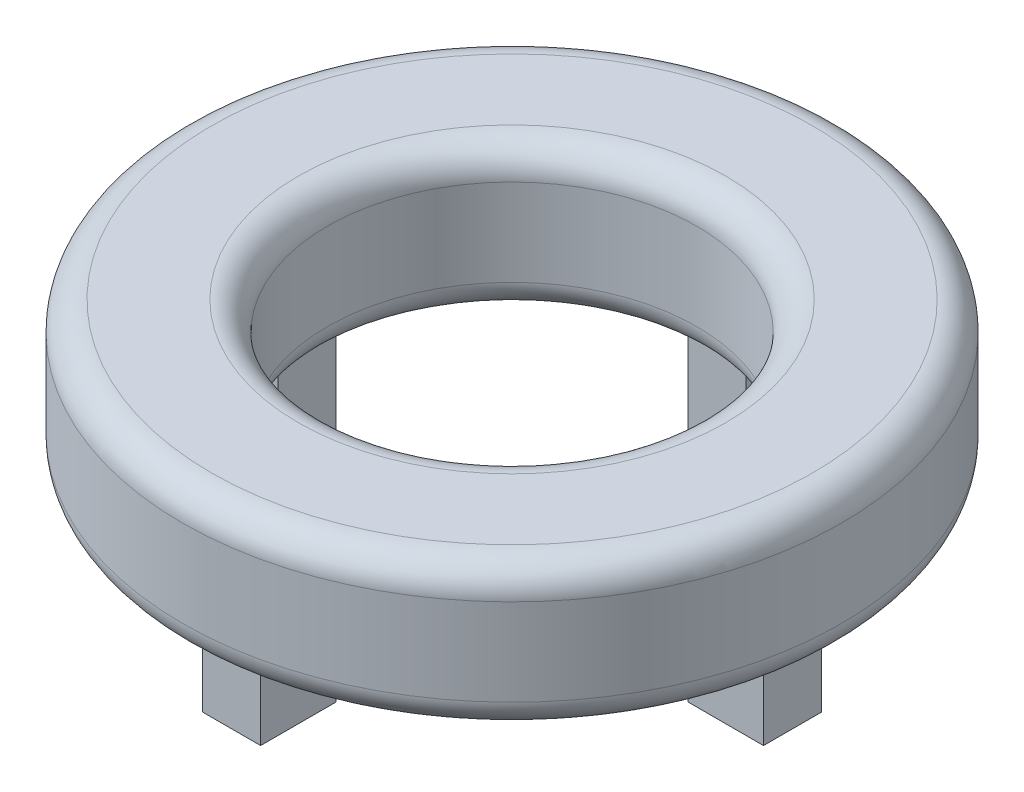
ISO-10303-21;
HEADER;
FILE_DESCRIPTION(('STEP AP214'),'2;1');
FILE_NAME('part.step','',(''),(''),'','','');
FILE_SCHEMA(('AUTOMOTIVE_DESIGN { 1 0 10303 214 1 1 1 1 }'));
ENDSEC;
DATA;
#1=APPLICATION_CONTEXT('core data for automotive mechanical design processes');
#2=APPLICATION_PROTOCOL_DEFINITION('international standard','automotive_design',2000,#1);
#3=PRODUCT_CONTEXT('',#1,'mechanical');
#4=PRODUCT('Part','Part','',(#3));
#5=PRODUCT_RELATED_PRODUCT_CATEGORY('part','',(#4));
#6=PRODUCT_DEFINITION_FORMATION('','',#4);
#7=PRODUCT_DEFINITION_CONTEXT('part definition',#1,'design');
#8=PRODUCT_DEFINITION('design','',#6,#7);
#9=PRODUCT_DEFINITION_SHAPE('','',#8);
#10=(LENGTH_UNIT() NAMED_UNIT(*) SI_UNIT(.MILLI.,.METRE.));
#11=(NAMED_UNIT(*) PLANE_ANGLE_UNIT() SI_UNIT($,.RADIAN.));
#12=(NAMED_UNIT(*) SI_UNIT($,.STERADIAN.) SOLID_ANGLE_UNIT());
#13=UNCERTAINTY_MEASURE_WITH_UNIT(LENGTH_MEASURE(1.E-05),#10,'distance_accuracy_value','');
#14=(GEOMETRIC_REPRESENTATION_CONTEXT(3) GLOBAL_UNCERTAINTY_ASSIGNED_CONTEXT((#13)) GLOBAL_UNIT_ASSIGNED_CONTEXT((#10,
#11,#12)) REPRESENTATION_CONTEXT('',''));
#15=CARTESIAN_POINT('',(0.,0.,0.));
#16=DIRECTION('',(0.,0.,1.));
#17=DIRECTION('',(1.,0.,0.));
#18=AXIS2_PLACEMENT_3D('',#15,#16,#17);
#19=CARTESIAN_POINT('',(0.,0.,0.));
#20=DIRECTION('',(0.,1.,0.));
#21=DIRECTION('',(0.,0.,1.));
#22=AXIS2_PLACEMENT_3D('',#19,#20,#21);
#23=PLANE('',#22);
#24=CARTESIAN_POINT('',(0.,0.,0.));
#25=DIRECTION('',(0.,1.,0.));
#26=DIRECTION('',(0.,0.,1.));
#27=AXIS2_PLACEMENT_3D('',#24,#25,#26);
#28=CIRCLE('',#27,51.8858506133116);
#29=CARTESIAN_POINT('',(0.,0.,51.8858506133116));
#30=VERTEX_POINT('',#29);
#31=EDGE_CURVE('E334',#30,#30,#28,.F.);
#32=ORIENTED_EDGE('',*,*,#31,.T.);
#33=EDGE_LOOP('',(#32));
#34=FACE_BOUND('',#33,.T.);
#35=DIRECTION('',(0.,0.,1.));
#36=VECTOR('',#35,1.);
#37=CARTESIAN_POINT('',(4.99999999999949,0.,48.4000000000001));
#38=LINE('',#37,#36);
#39=CARTESIAN_POINT('',(4.99999999999962,0.,36.5453960912663));
#40=VERTEX_POINT('',#39);
#41=CARTESIAN_POINT('',(4.99999999999949,0.,48.4000000000001));
#42=VERTEX_POINT('',#41);
#43=EDGE_CURVE('E537',#40,#42,#38,.T.);
#44=ORIENTED_EDGE('',*,*,#43,.F.);
#45=CARTESIAN_POINT('',(0.,0.,0.));
#46=DIRECTION('',(0.,1.,0.));
#47=DIRECTION('',(0.,0.,1.));
#48=AXIS2_PLACEMENT_3D('',#45,#46,#47);
#49=CIRCLE('',#48,36.8858506133116);
#50=CARTESIAN_POINT('',(36.5453960912662,0.,5.));
#51=VERTEX_POINT('',#50);
#52=EDGE_CURVE('E343',#40,#51,#49,.T.);
#53=ORIENTED_EDGE('',*,*,#52,.T.);
#54=DIRECTION('',(-1.,0.,0.));
#55=VECTOR('',#54,1.);
#56=CARTESIAN_POINT('',(48.4,0.,5.));
#57=LINE('',#56,#55);
#58=CARTESIAN_POINT('',(48.4,0.,5.));
#59=VERTEX_POINT('',#58);
#60=EDGE_CURVE('E222',#59,#51,#57,.T.);
#61=ORIENTED_EDGE('',*,*,#60,.F.);
#62=DIRECTION('',(0.,0.,1.));
#63=VECTOR('',#62,1.);
#64=CARTESIAN_POINT('',(48.4,0.,-5.));
#65=LINE('',#64,#63);
#66=CARTESIAN_POINT('',(48.4,0.,-5.));
#67=VERTEX_POINT('',#66);
#68=EDGE_CURVE('E235',#67,#59,#65,.T.);
#69=ORIENTED_EDGE('',*,*,#68,.F.);
#70=DIRECTION('',(1.,0.,0.));
#71=VECTOR('',#70,1.);
#72=CARTESIAN_POINT('',(48.4,0.,-5.));
#73=LINE('',#72,#71);
#74=CARTESIAN_POINT('',(36.5453960912662,0.,-5.));
#75=VERTEX_POINT('',#74);
#76=EDGE_CURVE('E231',#75,#67,#73,.T.);
#77=ORIENTED_EDGE('',*,*,#76,.F.);
#78=CARTESIAN_POINT('',(5.00000000000013,0.,-36.5453960912662));
#79=VERTEX_POINT('',#78);
#80=EDGE_CURVE('E840',#75,#79,#49,.T.);
#81=ORIENTED_EDGE('',*,*,#80,.T.);
#82=DIRECTION('',(0.,0.,1.));
#83=VECTOR('',#82,1.);
#84=CARTESIAN_POINT('',(5.00000000000017,0.,-48.4));
#85=LINE('',#84,#83);
#86=CARTESIAN_POINT('',(5.00000000000017,0.,-48.4));
#87=VERTEX_POINT('',#86);
#88=EDGE_CURVE('E263',#87,#79,#85,.T.);
#89=ORIENTED_EDGE('',*,*,#88,.F.);
#90=DIRECTION('',(1.,0.,0.));
#91=VECTOR('',#90,1.);
#92=CARTESIAN_POINT('',(-4.99999999999983,0.,-48.4));
#93=LINE('',#92,#91);
#94=CARTESIAN_POINT('',(-4.99999999999983,0.,-48.4));
#95=VERTEX_POINT('',#94);
#96=EDGE_CURVE('E276',#95,#87,#93,.T.);
#97=ORIENTED_EDGE('',*,*,#96,.F.);
#98=DIRECTION('',(0.,0.,-1.));
#99=VECTOR('',#98,1.);
#100=CARTESIAN_POINT('',(-4.99999999999983,0.,-48.4));
#101=LINE('',#100,#99);
#102=CARTESIAN_POINT('',(-4.99999999999987,0.,-36.5453960912906));
#103=VERTEX_POINT('',#102);
#104=EDGE_CURVE('E272',#103,#95,#101,.T.);
#105=ORIENTED_EDGE('',*,*,#104,.F.);
#106=CARTESIAN_POINT('',(-36.5453960912662,0.,-5.));
#107=VERTEX_POINT('',#106);
#108=EDGE_CURVE('E337',#103,#107,#49,.T.);
#109=ORIENTED_EDGE('',*,*,#108,.T.);
#110=DIRECTION('',(1.,0.,0.));
#111=VECTOR('',#110,1.);
#112=CARTESIAN_POINT('',(-48.4,0.,-5.));
#113=LINE('',#112,#111);
#114=CARTESIAN_POINT('',(-48.4,0.,-5.));
#115=VERTEX_POINT('',#114);
#116=EDGE_CURVE('E304',#115,#107,#113,.T.);
#117=ORIENTED_EDGE('',*,*,#116,.F.);
#118=DIRECTION('',(0.,0.,-1.));
#119=VECTOR('',#118,1.);
#120=CARTESIAN_POINT('',(-48.4,0.,5.));
#121=LINE('',#120,#119);
#122=CARTESIAN_POINT('',(-48.4,0.,5.));
#123=VERTEX_POINT('',#122);
#124=EDGE_CURVE('E317',#123,#115,#121,.T.);
#125=ORIENTED_EDGE('',*,*,#124,.F.);
#126=DIRECTION('',(-1.,0.,0.));
#127=VECTOR('',#126,1.);
#128=CARTESIAN_POINT('',(-48.4,0.,5.));
#129=LINE('',#128,#127);
#130=CARTESIAN_POINT('',(-36.5453960912908,0.,5.));
#131=VERTEX_POINT('',#130);
#132=EDGE_CURVE('E313',#131,#123,#129,.T.);
#133=ORIENTED_EDGE('',*,*,#132,.F.);
#134=CARTESIAN_POINT('',(-5.00000000000038,0.,36.5453960912662));
#135=VERTEX_POINT('',#134);
#136=EDGE_CURVE('E342',#131,#135,#49,.T.);
#137=ORIENTED_EDGE('',*,*,#136,.T.);
#138=DIRECTION('',(0.,0.,-1.));
#139=VECTOR('',#138,1.);
#140=CARTESIAN_POINT('',(-5.00000000000051,0.,48.3999999999999));
#141=LINE('',#140,#139);
#142=CARTESIAN_POINT('',(-5.00000000000051,0.,48.3999999999999));
#143=VERTEX_POINT('',#142);
#144=EDGE_CURVE('E63',#143,#135,#141,.T.);
#145=ORIENTED_EDGE('',*,*,#144,.F.);
#146=DIRECTION('',(-1.,0.,0.));
#147=VECTOR('',#146,1.);
#148=CARTESIAN_POINT('',(4.99999999999949,0.,48.4000000000001));
#149=LINE('',#148,#147);
#150=EDGE_CURVE('E58',#42,#143,#149,.T.);
#151=ORIENTED_EDGE('',*,*,#150,.F.);
#152=EDGE_LOOP('',(#44,#53,#61,#69,#77,#81,#89,#97,#105,#109,#117,#125,#133,#137,#145,#151));
#153=FACE_BOUND('',#152,.T.);
#154=ADVANCED_FACE('F43',(#34,#153),#23,.F.);
#155=CARTESIAN_POINT('',(0.,25.,0.));
#156=DIRECTION('',(0.,1.,0.));
#157=DIRECTION('',(0.,0.,1.));
#158=AXIS2_PLACEMENT_3D('',#155,#156,#157);
#159=PLANE('',#158);
#160=CARTESIAN_POINT('',(0.,25.,0.));
#161=DIRECTION('',(0.,1.,0.));
#162=DIRECTION('',(0.,0.,1.));
#163=AXIS2_PLACEMENT_3D('',#160,#161,#162);
#164=CIRCLE('',#163,36.8858506133116);
#165=CARTESIAN_POINT('',(0.,25.,36.8858506133116));
#166=VERTEX_POINT('',#165);
#167=EDGE_CURVE('E12',#166,#166,#164,.F.);
#168=ORIENTED_EDGE('',*,*,#167,.T.);
#169=EDGE_LOOP('',(#168));
#170=FACE_BOUND('',#169,.T.);
#171=CARTESIAN_POINT('',(0.,25.,0.));
#172=DIRECTION('',(0.,1.,0.));
#173=DIRECTION('',(0.,0.,1.));
#174=AXIS2_PLACEMENT_3D('',#171,#172,#173);
#175=CIRCLE('',#174,51.8858506133116);
#176=CARTESIAN_POINT('',(0.,25.,51.8858506133116));
#177=VERTEX_POINT('',#176);
#178=EDGE_CURVE('E51',#177,#177,#175,.T.);
#179=ORIENTED_EDGE('',*,*,#178,.T.);
#180=EDGE_LOOP('',(#179));
#181=FACE_BOUND('',#180,.T.);
#182=ADVANCED_FACE('F357',(#170,#181),#159,.T.);
#183=CARTESIAN_POINT('',(0.,25.,0.));
#184=DIRECTION('',(0.,-1.,0.));
#185=DIRECTION('',(0.,0.,-1.));
#186=AXIS2_PLACEMENT_3D('',#183,#184,#185);
#187=CYLINDRICAL_SURFACE('',#186,56.8858506133116);
#188=CARTESIAN_POINT('',(0.,5.,0.));
#189=DIRECTION('',(0.,1.,0.));
#190=DIRECTION('',(0.,0.,1.));
#191=AXIS2_PLACEMENT_3D('',#188,#189,#190);
#192=CIRCLE('',#191,56.8858506133116);
#193=CARTESIAN_POINT('',(0.,5.,56.8858506133116));
#194=VERTEX_POINT('',#193);
#195=EDGE_CURVE('E352',#194,#194,#192,.T.);
#196=ORIENTED_EDGE('',*,*,#195,.T.);
#197=EDGE_LOOP('',(#196));
#198=FACE_BOUND('',#197,.T.);
#199=CARTESIAN_POINT('',(0.,20.,0.));
#200=DIRECTION('',(0.,1.,0.));
#201=DIRECTION('',(0.,0.,1.));
#202=AXIS2_PLACEMENT_3D('',#199,#200,#201);
#203=CIRCLE('',#202,56.8858506133116);
#204=CARTESIAN_POINT('',(0.,20.,56.8858506133116));
#205=VERTEX_POINT('',#204);
#206=EDGE_CURVE('E349',#205,#205,#203,.F.);
#207=ORIENTED_EDGE('',*,*,#206,.T.);
#208=EDGE_LOOP('',(#207));
#209=FACE_BOUND('',#208,.T.);
#210=ADVANCED_FACE('F381',(#198,#209),#187,.T.);
#211=CARTESIAN_POINT('',(0.,25.,0.));
#212=DIRECTION('',(0.,-1.,0.));
#213=DIRECTION('',(0.,0.,-1.));
#214=AXIS2_PLACEMENT_3D('',#211,#212,#213);
#215=CYLINDRICAL_SURFACE('',#214,31.8858506133116);
#216=CARTESIAN_POINT('',(0.,5.,0.));
#217=DIRECTION('',(0.,1.,0.));
#218=DIRECTION('',(0.,0.,1.));
#219=AXIS2_PLACEMENT_3D('',#216,#217,#218);
#220=CIRCLE('',#219,31.8858506133116);
#221=CARTESIAN_POINT('',(0.,5.,31.8858506133116));
#222=VERTEX_POINT('',#221);
#223=EDGE_CURVE('E346',#222,#222,#220,.F.);
#224=ORIENTED_EDGE('',*,*,#223,.T.);
#225=EDGE_LOOP('',(#224));
#226=FACE_BOUND('',#225,.T.);
#227=CARTESIAN_POINT('',(0.,20.,0.));
#228=DIRECTION('',(0.,1.,0.));
#229=DIRECTION('',(0.,0.,1.));
#230=AXIS2_PLACEMENT_3D('',#227,#228,#229);
#231=CIRCLE('',#230,31.8858506133116);
#232=CARTESIAN_POINT('',(0.,20.,31.8858506133116));
#233=VERTEX_POINT('',#232);
#234=EDGE_CURVE('E341',#233,#233,#231,.T.);
#235=ORIENTED_EDGE('',*,*,#234,.T.);
#236=EDGE_LOOP('',(#235));
#237=FACE_BOUND('',#236,.T.);
#238=ADVANCED_FACE('F491',(#226,#237),#215,.F.);
#239=CARTESIAN_POINT('',(0.,5.,0.));
#240=DIRECTION('',(0.,1.,0.));
#241=DIRECTION('',(0.,0.,1.));
#242=AXIS2_PLACEMENT_3D('',#239,#240,#241);
#243=TOROIDAL_SURFACE('',#242,36.8858506133116,5.);
#244=ORIENTED_EDGE('',*,*,#223,.F.);
#245=EDGE_LOOP('',(#244));
#246=FACE_BOUND('',#245,.T.);
#247=EDGE_CURVE('E338',#107,#131,#49,.T.);
#248=ORIENTED_EDGE('',*,*,#247,.F.);
#249=ORIENTED_EDGE('',*,*,#108,.F.);
#250=EDGE_CURVE('E521',#79,#103,#49,.T.);
#251=ORIENTED_EDGE('',*,*,#250,.F.);
#252=ORIENTED_EDGE('',*,*,#80,.F.);
#253=EDGE_CURVE('E837',#51,#75,#49,.T.);
#254=ORIENTED_EDGE('',*,*,#253,.F.);
#255=ORIENTED_EDGE('',*,*,#52,.F.);
#256=EDGE_CURVE('E520',#135,#40,#49,.T.);
#257=ORIENTED_EDGE('',*,*,#256,.F.);
#258=ORIENTED_EDGE('',*,*,#136,.F.);
#259=EDGE_LOOP('',(#248,#249,#251,#252,#254,#255,#257,#258));
#260=FACE_BOUND('',#259,.T.);
#261=ADVANCED_FACE('F493',(#246,#260),#243,.T.);
#262=CARTESIAN_POINT('',(0.,5.,0.));
#263=DIRECTION('',(0.,1.,0.));
#264=DIRECTION('',(0.,0.,1.));
#265=AXIS2_PLACEMENT_3D('',#262,#263,#264);
#266=TOROIDAL_SURFACE('',#265,51.8858506133116,5.);
#267=ORIENTED_EDGE('',*,*,#31,.F.);
#268=EDGE_LOOP('',(#267));
#269=FACE_BOUND('',#268,.T.);
#270=ORIENTED_EDGE('',*,*,#195,.F.);
#271=EDGE_LOOP('',(#270));
#272=FACE_BOUND('',#271,.T.);
#273=ADVANCED_FACE('F370',(#269,#272),#266,.T.);
#274=CARTESIAN_POINT('',(0.,20.,0.));
#275=DIRECTION('',(0.,1.,0.));
#276=DIRECTION('',(0.,0.,1.));
#277=AXIS2_PLACEMENT_3D('',#274,#275,#276);
#278=TOROIDAL_SURFACE('',#277,36.8858506133116,5.);
#279=ORIENTED_EDGE('',*,*,#167,.F.);
#280=EDGE_LOOP('',(#279));
#281=FACE_BOUND('',#280,.T.);
#282=ORIENTED_EDGE('',*,*,#234,.F.);
#283=EDGE_LOOP('',(#282));
#284=FACE_BOUND('',#283,.T.);
#285=ADVANCED_FACE('F361',(#281,#284),#278,.T.);
#286=CARTESIAN_POINT('',(0.,20.,0.));
#287=DIRECTION('',(0.,1.,0.));
#288=DIRECTION('',(0.,0.,1.));
#289=AXIS2_PLACEMENT_3D('',#286,#287,#288);
#290=TOROIDAL_SURFACE('',#289,51.8858506133116,5.);
#291=ORIENTED_EDGE('',*,*,#206,.F.);
#292=EDGE_LOOP('',(#291));
#293=FACE_BOUND('',#292,.T.);
#294=ORIENTED_EDGE('',*,*,#178,.F.);
#295=EDGE_LOOP('',(#294));
#296=FACE_BOUND('',#295,.T.);
#297=ADVANCED_FACE('F45',(#293,#296),#290,.T.);
#298=CARTESIAN_POINT('',(0.,-15.,0.));
#299=DIRECTION('',(0.,-1.,0.));
#300=DIRECTION('',(0.,0.,-1.));
#301=AXIS2_PLACEMENT_3D('',#298,#299,#300);
#302=PLANE('',#301);
#303=DIRECTION('',(0.,0.,1.));
#304=VECTOR('',#303,1.);
#305=CARTESIAN_POINT('',(-35.4,-15.,5.));
#306=LINE('',#305,#304);
#307=CARTESIAN_POINT('',(-35.4,-15.,-5.));
#308=VERTEX_POINT('',#307);
#309=CARTESIAN_POINT('',(-35.4,-15.,5.));
#310=VERTEX_POINT('',#309);
#311=EDGE_CURVE('E300',#308,#310,#306,.T.);
#312=ORIENTED_EDGE('',*,*,#311,.T.);
#313=DIRECTION('',(-1.,0.,0.));
#314=VECTOR('',#313,1.);
#315=CARTESIAN_POINT('',(-48.4,-15.,5.));
#316=LINE('',#315,#314);
#317=CARTESIAN_POINT('',(-48.4,-15.,5.));
#318=VERTEX_POINT('',#317);
#319=EDGE_CURVE('E303',#310,#318,#316,.T.);
#320=ORIENTED_EDGE('',*,*,#319,.T.);
#321=DIRECTION('',(0.,0.,-1.));
#322=VECTOR('',#321,1.);
#323=CARTESIAN_POINT('',(-48.4,-15.,5.));
#324=LINE('',#323,#322);
#325=CARTESIAN_POINT('',(-48.4,-15.,-5.));
#326=VERTEX_POINT('',#325);
#327=EDGE_CURVE('E306',#318,#326,#324,.T.);
#328=ORIENTED_EDGE('',*,*,#327,.T.);
#329=DIRECTION('',(1.,0.,0.));
#330=VECTOR('',#329,1.);
#331=CARTESIAN_POINT('',(-48.4,-15.,-5.));
#332=LINE('',#331,#330);
#333=EDGE_CURVE('E308',#326,#308,#332,.T.);
#334=ORIENTED_EDGE('',*,*,#333,.T.);
#335=EDGE_LOOP('',(#312,#320,#328,#334));
#336=FACE_BOUND('',#335,.T.);
#337=CARTESIAN_POINT('',(-41.9,-15.,0.));
#338=DIRECTION('',(0.,-1.,0.));
#339=DIRECTION('',(0.,0.,-1.));
#340=AXIS2_PLACEMENT_3D('',#337,#338,#339);
#341=CIRCLE('',#340,2.25);
#342=CARTESIAN_POINT('',(-41.9,-15.,-2.25));
#343=VERTEX_POINT('',#342);
#344=EDGE_CURVE('E294',#343,#343,#341,.T.);
#345=ORIENTED_EDGE('',*,*,#344,.F.);
#346=EDGE_LOOP('',(#345));
#347=FACE_BOUND('',#346,.T.);
#348=ADVANCED_FACE('F360',(#336,#347),#302,.T.);
#349=CARTESIAN_POINT('',(0.,0.,0.));
#350=DIRECTION('',(0.,-1.,0.));
#351=DIRECTION('',(0.,0.,-1.));
#352=AXIS2_PLACEMENT_3D('',#349,#350,#351);
#353=PLANE('',#352);
#354=ORIENTED_EDGE('',*,*,#247,.T.);
#355=CARTESIAN_POINT('',(-35.4,0.,5.));
#356=VERTEX_POINT('',#355);
#357=EDGE_CURVE('E314',#356,#131,#129,.T.);
#358=ORIENTED_EDGE('',*,*,#357,.F.);
#359=DIRECTION('',(0.,0.,1.));
#360=VECTOR('',#359,1.);
#361=CARTESIAN_POINT('',(-35.4,0.,5.));
#362=LINE('',#361,#360);
#363=CARTESIAN_POINT('',(-35.4,0.,-5.));
#364=VERTEX_POINT('',#363);
#365=EDGE_CURVE('E297',#364,#356,#362,.T.);
#366=ORIENTED_EDGE('',*,*,#365,.F.);
#367=EDGE_CURVE('E320',#107,#364,#113,.T.);
#368=ORIENTED_EDGE('',*,*,#367,.F.);
#369=EDGE_LOOP('',(#354,#358,#366,#368));
#370=FACE_BOUND('',#369,.T.);
#371=ADVANCED_FACE('F367',(#370),#353,.F.);
#372=CARTESIAN_POINT('',(-35.4,-15.,5.));
#373=DIRECTION('',(-1.,0.,0.));
#374=DIRECTION('',(0.,0.,1.));
#375=AXIS2_PLACEMENT_3D('',#372,#373,#374);
#376=PLANE('',#375);
#377=ORIENTED_EDGE('',*,*,#365,.T.);
#378=DIRECTION('',(0.,1.,0.));
#379=VECTOR('',#378,1.);
#380=CARTESIAN_POINT('',(-35.4,-15.,5.));
#381=LINE('',#380,#379);
#382=EDGE_CURVE('E331',#310,#356,#381,.T.);
#383=ORIENTED_EDGE('',*,*,#382,.F.);
#384=ORIENTED_EDGE('',*,*,#311,.F.);
#385=DIRECTION('',(0.,1.,0.));
#386=VECTOR('',#385,1.);
#387=CARTESIAN_POINT('',(-35.4,-15.,-5.));
#388=LINE('',#387,#386);
#389=EDGE_CURVE('E310',#308,#364,#388,.T.);
#390=ORIENTED_EDGE('',*,*,#389,.T.);
#391=EDGE_LOOP('',(#377,#383,#384,#390));
#392=FACE_BOUND('',#391,.T.);
#393=ADVANCED_FACE('F475',(#392),#376,.F.);
#394=CARTESIAN_POINT('',(-48.4,-15.,5.));
#395=DIRECTION('',(0.,0.,-1.));
#396=DIRECTION('',(-1.,0.,0.));
#397=AXIS2_PLACEMENT_3D('',#394,#395,#396);
#398=PLANE('',#397);
#399=ORIENTED_EDGE('',*,*,#357,.T.);
#400=ORIENTED_EDGE('',*,*,#132,.T.);
#401=DIRECTION('',(0.,1.,0.));
#402=VECTOR('',#401,1.);
#403=CARTESIAN_POINT('',(-48.4,-15.,5.));
#404=LINE('',#403,#402);
#405=EDGE_CURVE('E328',#318,#123,#404,.T.);
#406=ORIENTED_EDGE('',*,*,#405,.F.);
#407=ORIENTED_EDGE('',*,*,#319,.F.);
#408=ORIENTED_EDGE('',*,*,#382,.T.);
#409=EDGE_LOOP('',(#399,#400,#406,#407,#408));
#410=FACE_BOUND('',#409,.T.);
#411=ADVANCED_FACE('F483',(#410),#398,.F.);
#412=CARTESIAN_POINT('',(-48.4,-15.,5.));
#413=DIRECTION('',(1.,0.,0.));
#414=DIRECTION('',(0.,0.,-1.));
#415=AXIS2_PLACEMENT_3D('',#412,#413,#414);
#416=PLANE('',#415);
#417=ORIENTED_EDGE('',*,*,#124,.T.);
#418=DIRECTION('',(0.,1.,0.));
#419=VECTOR('',#418,1.);
#420=CARTESIAN_POINT('',(-48.4,-15.,-5.));
#421=LINE('',#420,#419);
#422=EDGE_CURVE('E325',#326,#115,#421,.T.);
#423=ORIENTED_EDGE('',*,*,#422,.F.);
#424=ORIENTED_EDGE('',*,*,#327,.F.);
#425=ORIENTED_EDGE('',*,*,#405,.T.);
#426=EDGE_LOOP('',(#417,#423,#424,#425));
#427=FACE_BOUND('',#426,.T.);
#428=ADVANCED_FACE('F479',(#427),#416,.F.);
#429=CARTESIAN_POINT('',(-48.4,-15.,-5.));
#430=DIRECTION('',(0.,0.,1.));
#431=DIRECTION('',(1.,0.,0.));
#432=AXIS2_PLACEMENT_3D('',#429,#430,#431);
#433=PLANE('',#432);
#434=ORIENTED_EDGE('',*,*,#116,.T.);
#435=ORIENTED_EDGE('',*,*,#367,.T.);
#436=ORIENTED_EDGE('',*,*,#389,.F.);
#437=ORIENTED_EDGE('',*,*,#333,.F.);
#438=ORIENTED_EDGE('',*,*,#422,.T.);
#439=EDGE_LOOP('',(#434,#435,#436,#437,#438));
#440=FACE_BOUND('',#439,.T.);
#441=ADVANCED_FACE('F401',(#440),#433,.F.);
#442=CARTESIAN_POINT('',(-41.9,-15.,0.));
#443=DIRECTION('',(0.,1.,0.));
#444=DIRECTION('',(0.,0.,1.));
#445=AXIS2_PLACEMENT_3D('',#442,#443,#444);
#446=CYLINDRICAL_SURFACE('',#445,2.25);
#447=ORIENTED_EDGE('',*,*,#344,.T.);
#448=EDGE_LOOP('',(#447));
#449=FACE_BOUND('',#448,.T.);
#450=CARTESIAN_POINT('',(-41.9,0.,0.));
#451=DIRECTION('',(0.,-1.,0.));
#452=DIRECTION('',(0.,0.,-1.));
#453=AXIS2_PLACEMENT_3D('',#450,#451,#452);
#454=CIRCLE('',#453,2.25);
#455=CARTESIAN_POINT('',(-41.9,0.,-2.25));
#456=VERTEX_POINT('',#455);
#457=EDGE_CURVE('E293',#456,#456,#454,.T.);
#458=ORIENTED_EDGE('',*,*,#457,.F.);
#459=EDGE_LOOP('',(#458));
#460=FACE_BOUND('',#459,.T.);
#461=ADVANCED_FACE('F391',(#449,#460),#446,.F.);
#462=ORIENTED_EDGE('',*,*,#457,.T.);
#463=EDGE_LOOP('',(#462));
#464=FACE_BOUND('',#463,.T.);
#465=ADVANCED_FACE('F377',(#464),#23,.F.);
#466=CARTESIAN_POINT('',(0.,-15.,0.));
#467=DIRECTION('',(0.,-1.,0.));
#468=DIRECTION('',(1.,0.,0.));
#469=AXIS2_PLACEMENT_3D('',#466,#467,#468);
#470=PLANE('',#469);
#471=DIRECTION('',(-1.,0.,0.));
#472=VECTOR('',#471,1.);
#473=CARTESIAN_POINT('',(-4.99999999999988,-15.,-35.4));
#474=LINE('',#473,#472);
#475=CARTESIAN_POINT('',(5.00000000000012,-15.,-35.4));
#476=VERTEX_POINT('',#475);
#477=CARTESIAN_POINT('',(-4.99999999999988,-15.,-35.4));
#478=VERTEX_POINT('',#477);
#479=EDGE_CURVE('E259',#476,#478,#474,.T.);
#480=ORIENTED_EDGE('',*,*,#479,.T.);
#481=DIRECTION('',(0.,0.,-1.));
#482=VECTOR('',#481,1.);
#483=CARTESIAN_POINT('',(-4.99999999999983,-15.,-48.4));
#484=LINE('',#483,#482);
#485=CARTESIAN_POINT('',(-4.99999999999983,-15.,-48.4));
#486=VERTEX_POINT('',#485);
#487=EDGE_CURVE('E262',#478,#486,#484,.T.);
#488=ORIENTED_EDGE('',*,*,#487,.T.);
#489=DIRECTION('',(1.,0.,0.));
#490=VECTOR('',#489,1.);
#491=CARTESIAN_POINT('',(-4.99999999999983,-15.,-48.4));
#492=LINE('',#491,#490);
#493=CARTESIAN_POINT('',(5.00000000000017,-15.,-48.4));
#494=VERTEX_POINT('',#493);
#495=EDGE_CURVE('E265',#486,#494,#492,.T.);
#496=ORIENTED_EDGE('',*,*,#495,.T.);
#497=DIRECTION('',(0.,0.,1.));
#498=VECTOR('',#497,1.);
#499=CARTESIAN_POINT('',(5.00000000000017,-15.,-48.4));
#500=LINE('',#499,#498);
#501=EDGE_CURVE('E267',#494,#476,#500,.T.);
#502=ORIENTED_EDGE('',*,*,#501,.T.);
#503=EDGE_LOOP('',(#480,#488,#496,#502));
#504=FACE_BOUND('',#503,.T.);
#505=CARTESIAN_POINT('',(1.44775185056048E-13,-15.,-41.9));
#506=DIRECTION('',(0.,-1.,0.));
#507=DIRECTION('',(1.,0.,0.));
#508=AXIS2_PLACEMENT_3D('',#505,#506,#507);
#509=CIRCLE('',#508,2.25);
#510=CARTESIAN_POINT('',(2.25000000000015,-15.,-41.9));
#511=VERTEX_POINT('',#510);
#512=EDGE_CURVE('E253',#511,#511,#509,.T.);
#513=ORIENTED_EDGE('',*,*,#512,.F.);
#514=EDGE_LOOP('',(#513));
#515=FACE_BOUND('',#514,.T.);
#516=ADVANCED_FACE('F390',(#504,#515),#470,.T.);
#517=CARTESIAN_POINT('',(0.,0.,0.));
#518=DIRECTION('',(0.,-1.,0.));
#519=DIRECTION('',(1.,0.,0.));
#520=AXIS2_PLACEMENT_3D('',#517,#518,#519);
#521=PLANE('',#520);
#522=ORIENTED_EDGE('',*,*,#250,.T.);
#523=CARTESIAN_POINT('',(-4.99999999999988,0.,-35.4));
#524=VERTEX_POINT('',#523);
#525=EDGE_CURVE('E273',#524,#103,#101,.T.);
#526=ORIENTED_EDGE('',*,*,#525,.F.);
#527=DIRECTION('',(-1.,0.,0.));
#528=VECTOR('',#527,1.);
#529=CARTESIAN_POINT('',(-4.99999999999988,0.,-35.4));
#530=LINE('',#529,#528);
#531=CARTESIAN_POINT('',(5.00000000000012,0.,-35.4));
#532=VERTEX_POINT('',#531);
#533=EDGE_CURVE('E256',#532,#524,#530,.T.);
#534=ORIENTED_EDGE('',*,*,#533,.F.);
#535=EDGE_CURVE('E279',#79,#532,#85,.T.);
#536=ORIENTED_EDGE('',*,*,#535,.F.);
#537=EDGE_LOOP('',(#522,#526,#534,#536));
#538=FACE_BOUND('',#537,.T.);
#539=ADVANCED_FACE('F398',(#538),#521,.F.);
#540=CARTESIAN_POINT('',(-4.99999999999988,-15.,-35.4));
#541=DIRECTION('',(0.,0.,-1.));
#542=DIRECTION('',(-1.,0.,0.));
#543=AXIS2_PLACEMENT_3D('',#540,#541,#542);
#544=PLANE('',#543);
#545=ORIENTED_EDGE('',*,*,#533,.T.);
#546=DIRECTION('',(0.,1.,0.));
#547=VECTOR('',#546,1.);
#548=CARTESIAN_POINT('',(-4.99999999999988,-15.,-35.4));
#549=LINE('',#548,#547);
#550=EDGE_CURVE('E290',#478,#524,#549,.T.);
#551=ORIENTED_EDGE('',*,*,#550,.F.);
#552=ORIENTED_EDGE('',*,*,#479,.F.);
#553=DIRECTION('',(0.,1.,0.));
#554=VECTOR('',#553,1.);
#555=CARTESIAN_POINT('',(5.00000000000012,-15.,-35.4));
#556=LINE('',#555,#554);
#557=EDGE_CURVE('E269',#476,#532,#556,.T.);
#558=ORIENTED_EDGE('',*,*,#557,.T.);
#559=EDGE_LOOP('',(#545,#551,#552,#558));
#560=FACE_BOUND('',#559,.T.);
#561=ADVANCED_FACE('F457',(#560),#544,.F.);
#562=CARTESIAN_POINT('',(-4.99999999999983,-15.,-48.4));
#563=DIRECTION('',(1.,0.,0.));
#564=DIRECTION('',(0.,0.,-1.));
#565=AXIS2_PLACEMENT_3D('',#562,#563,#564);
#566=PLANE('',#565);
#567=ORIENTED_EDGE('',*,*,#525,.T.);
#568=ORIENTED_EDGE('',*,*,#104,.T.);
#569=DIRECTION('',(0.,1.,0.));
#570=VECTOR('',#569,1.);
#571=CARTESIAN_POINT('',(-4.99999999999983,-15.,-48.4));
#572=LINE('',#571,#570);
#573=EDGE_CURVE('E287',#486,#95,#572,.T.);
#574=ORIENTED_EDGE('',*,*,#573,.F.);
#575=ORIENTED_EDGE('',*,*,#487,.F.);
#576=ORIENTED_EDGE('',*,*,#550,.T.);
#577=EDGE_LOOP('',(#567,#568,#574,#575,#576));
#578=FACE_BOUND('',#577,.T.);
#579=ADVANCED_FACE('F465',(#578),#566,.F.);
#580=CARTESIAN_POINT('',(-4.99999999999983,-15.,-48.4));
#581=DIRECTION('',(0.,0.,1.));
#582=DIRECTION('',(1.,0.,0.));
#583=AXIS2_PLACEMENT_3D('',#580,#581,#582);
#584=PLANE('',#583);
#585=ORIENTED_EDGE('',*,*,#96,.T.);
#586=DIRECTION('',(0.,1.,0.));
#587=VECTOR('',#586,1.);
#588=CARTESIAN_POINT('',(5.00000000000017,-15.,-48.4));
#589=LINE('',#588,#587);
#590=EDGE_CURVE('E284',#494,#87,#589,.T.);
#591=ORIENTED_EDGE('',*,*,#590,.F.);
#592=ORIENTED_EDGE('',*,*,#495,.F.);
#593=ORIENTED_EDGE('',*,*,#573,.T.);
#594=EDGE_LOOP('',(#585,#591,#592,#593));
#595=FACE_BOUND('',#594,.T.);
#596=ADVANCED_FACE('F461',(#595),#584,.F.);
#597=CARTESIAN_POINT('',(5.00000000000017,-15.,-48.4));
#598=DIRECTION('',(-1.,0.,0.));
#599=DIRECTION('',(0.,0.,1.));
#600=AXIS2_PLACEMENT_3D('',#597,#598,#599);
#601=PLANE('',#600);
#602=ORIENTED_EDGE('',*,*,#88,.T.);
#603=ORIENTED_EDGE('',*,*,#535,.T.);
#604=ORIENTED_EDGE('',*,*,#557,.F.);
#605=ORIENTED_EDGE('',*,*,#501,.F.);
#606=ORIENTED_EDGE('',*,*,#590,.T.);
#607=EDGE_LOOP('',(#602,#603,#604,#605,#606));
#608=FACE_BOUND('',#607,.T.);
#609=ADVANCED_FACE('F415',(#608),#601,.F.);
#610=CARTESIAN_POINT('',(1.44775185056048E-13,-15.,-41.9));
#611=DIRECTION('',(0.,1.,0.));
#612=DIRECTION('',(0.,0.,1.));
#613=AXIS2_PLACEMENT_3D('',#610,#611,#612);
#614=CYLINDRICAL_SURFACE('',#613,2.25);
#615=ORIENTED_EDGE('',*,*,#512,.T.);
#616=EDGE_LOOP('',(#615));
#617=FACE_BOUND('',#616,.T.);
#618=CARTESIAN_POINT('',(1.44775185056048E-13,0.,-41.9));
#619=DIRECTION('',(0.,-1.,0.));
#620=DIRECTION('',(1.,0.,0.));
#621=AXIS2_PLACEMENT_3D('',#618,#619,#620);
#622=CIRCLE('',#621,2.25);
#623=CARTESIAN_POINT('',(2.25000000000015,0.,-41.9));
#624=VERTEX_POINT('',#623);
#625=EDGE_CURVE('E252',#624,#624,#622,.T.);
#626=ORIENTED_EDGE('',*,*,#625,.F.);
#627=EDGE_LOOP('',(#626));
#628=FACE_BOUND('',#627,.T.);
#629=ADVANCED_FACE('F406',(#617,#628),#614,.F.);
#630=ORIENTED_EDGE('',*,*,#625,.T.);
#631=EDGE_LOOP('',(#630));
#632=FACE_BOUND('',#631,.T.);
#633=ADVANCED_FACE('F393',(#632),#23,.F.);
#634=CARTESIAN_POINT('',(0.,-15.,0.));
#635=DIRECTION('',(0.,-1.,0.));
#636=DIRECTION('',(0.,0.,1.));
#637=AXIS2_PLACEMENT_3D('',#634,#635,#636);
#638=PLANE('',#637);
#639=DIRECTION('',(0.,0.,-1.));
#640=VECTOR('',#639,1.);
#641=CARTESIAN_POINT('',(35.4,-15.,-5.));
#642=LINE('',#641,#640);
#643=CARTESIAN_POINT('',(35.4,-15.,5.));
#644=VERTEX_POINT('',#643);
#645=CARTESIAN_POINT('',(35.4,-15.,-5.));
#646=VERTEX_POINT('',#645);
#647=EDGE_CURVE('E218',#644,#646,#642,.T.);
#648=ORIENTED_EDGE('',*,*,#647,.T.);
#649=DIRECTION('',(1.,0.,0.));
#650=VECTOR('',#649,1.);
#651=CARTESIAN_POINT('',(48.4,-15.,-5.));
#652=LINE('',#651,#650);
#653=CARTESIAN_POINT('',(48.4,-15.,-5.));
#654=VERTEX_POINT('',#653);
#655=EDGE_CURVE('E221',#646,#654,#652,.T.);
#656=ORIENTED_EDGE('',*,*,#655,.T.);
#657=DIRECTION('',(0.,0.,1.));
#658=VECTOR('',#657,1.);
#659=CARTESIAN_POINT('',(48.4,-15.,-5.));
#660=LINE('',#659,#658);
#661=CARTESIAN_POINT('',(48.4,-15.,5.));
#662=VERTEX_POINT('',#661);
#663=EDGE_CURVE('E224',#654,#662,#660,.T.);
#664=ORIENTED_EDGE('',*,*,#663,.T.);
#665=DIRECTION('',(-1.,0.,0.));
#666=VECTOR('',#665,1.);
#667=CARTESIAN_POINT('',(48.4,-15.,5.));
#668=LINE('',#667,#666);
#669=EDGE_CURVE('E226',#662,#644,#668,.T.);
#670=ORIENTED_EDGE('',*,*,#669,.T.);
#671=EDGE_LOOP('',(#648,#656,#664,#670));
#672=FACE_BOUND('',#671,.T.);
#673=CARTESIAN_POINT('',(41.9,-15.,0.));
#674=DIRECTION('',(0.,-1.,0.));
#675=DIRECTION('',(0.,0.,1.));
#676=AXIS2_PLACEMENT_3D('',#673,#674,#675);
#677=CIRCLE('',#676,2.25);
#678=CARTESIAN_POINT('',(41.9,-15.,2.25));
#679=VERTEX_POINT('',#678);
#680=EDGE_CURVE('E209',#679,#679,#677,.T.);
#681=ORIENTED_EDGE('',*,*,#680,.F.);
#682=EDGE_LOOP('',(#681));
#683=FACE_BOUND('',#682,.T.);
#684=ADVANCED_FACE('F405',(#672,#683),#638,.T.);
#685=CARTESIAN_POINT('',(0.,0.,0.));
#686=DIRECTION('',(0.,-1.,0.));
#687=DIRECTION('',(0.,0.,1.));
#688=AXIS2_PLACEMENT_3D('',#685,#686,#687);
#689=PLANE('',#688);
#690=ORIENTED_EDGE('',*,*,#253,.T.);
#691=CARTESIAN_POINT('',(35.4,0.,-5.));
#692=VERTEX_POINT('',#691);
#693=EDGE_CURVE('E232',#692,#75,#73,.T.);
#694=ORIENTED_EDGE('',*,*,#693,.F.);
#695=DIRECTION('',(0.,0.,-1.));
#696=VECTOR('',#695,1.);
#697=CARTESIAN_POINT('',(35.4,0.,-5.));
#698=LINE('',#697,#696);
#699=CARTESIAN_POINT('',(35.4,0.,5.));
#700=VERTEX_POINT('',#699);
#701=EDGE_CURVE('E216',#700,#692,#698,.T.);
#702=ORIENTED_EDGE('',*,*,#701,.F.);
#703=EDGE_CURVE('E238',#51,#700,#57,.T.);
#704=ORIENTED_EDGE('',*,*,#703,.F.);
#705=EDGE_LOOP('',(#690,#694,#702,#704));
#706=FACE_BOUND('',#705,.T.);
#707=ADVANCED_FACE('F412',(#706),#689,.F.);
#708=CARTESIAN_POINT('',(35.4,-15.,-5.));
#709=DIRECTION('',(1.,0.,0.));
#710=DIRECTION('',(0.,0.,-1.));
#711=AXIS2_PLACEMENT_3D('',#708,#709,#710);
#712=PLANE('',#711);
#713=ORIENTED_EDGE('',*,*,#701,.T.);
#714=DIRECTION('',(0.,1.,0.));
#715=VECTOR('',#714,1.);
#716=CARTESIAN_POINT('',(35.4,-15.,-5.));
#717=LINE('',#716,#715);
#718=EDGE_CURVE('E249',#646,#692,#717,.T.);
#719=ORIENTED_EDGE('',*,*,#718,.F.);
#720=ORIENTED_EDGE('',*,*,#647,.F.);
#721=DIRECTION('',(0.,1.,0.));
#722=VECTOR('',#721,1.);
#723=CARTESIAN_POINT('',(35.4,-15.,5.));
#724=LINE('',#723,#722);
#725=EDGE_CURVE('E228',#644,#700,#724,.T.);
#726=ORIENTED_EDGE('',*,*,#725,.T.);
#727=EDGE_LOOP('',(#713,#719,#720,#726));
#728=FACE_BOUND('',#727,.T.);
#729=ADVANCED_FACE('F442',(#728),#712,.F.);
#730=CARTESIAN_POINT('',(48.4,-15.,-5.));
#731=DIRECTION('',(0.,0.,1.));
#732=DIRECTION('',(1.,0.,0.));
#733=AXIS2_PLACEMENT_3D('',#730,#731,#732);
#734=PLANE('',#733);
#735=ORIENTED_EDGE('',*,*,#693,.T.);
#736=ORIENTED_EDGE('',*,*,#76,.T.);
#737=DIRECTION('',(0.,1.,0.));
#738=VECTOR('',#737,1.);
#739=CARTESIAN_POINT('',(48.4,-15.,-5.));
#740=LINE('',#739,#738);
#741=EDGE_CURVE('E246',#654,#67,#740,.T.);
#742=ORIENTED_EDGE('',*,*,#741,.F.);
#743=ORIENTED_EDGE('',*,*,#655,.F.);
#744=ORIENTED_EDGE('',*,*,#718,.T.);
#745=EDGE_LOOP('',(#735,#736,#742,#743,#744));
#746=FACE_BOUND('',#745,.T.);
#747=ADVANCED_FACE('F447',(#746),#734,.F.);
#748=CARTESIAN_POINT('',(48.4,-15.,-5.));
#749=DIRECTION('',(-1.,0.,0.));
#750=DIRECTION('',(0.,0.,1.));
#751=AXIS2_PLACEMENT_3D('',#748,#749,#750);
#752=PLANE('',#751);
#753=ORIENTED_EDGE('',*,*,#68,.T.);
#754=DIRECTION('',(0.,1.,0.));
#755=VECTOR('',#754,1.);
#756=CARTESIAN_POINT('',(48.4,-15.,5.));
#757=LINE('',#756,#755);
#758=EDGE_CURVE('E243',#662,#59,#757,.T.);
#759=ORIENTED_EDGE('',*,*,#758,.F.);
#760=ORIENTED_EDGE('',*,*,#663,.F.);
#761=ORIENTED_EDGE('',*,*,#741,.T.);
#762=EDGE_LOOP('',(#753,#759,#760,#761));
#763=FACE_BOUND('',#762,.T.);
#764=ADVANCED_FACE('F435',(#763),#752,.F.);
#765=CARTESIAN_POINT('',(48.4,-15.,5.));
#766=DIRECTION('',(0.,0.,-1.));
#767=DIRECTION('',(-1.,0.,0.));
#768=AXIS2_PLACEMENT_3D('',#765,#766,#767);
#769=PLANE('',#768);
#770=ORIENTED_EDGE('',*,*,#60,.T.);
#771=ORIENTED_EDGE('',*,*,#703,.T.);
#772=ORIENTED_EDGE('',*,*,#725,.F.);
#773=ORIENTED_EDGE('',*,*,#669,.F.);
#774=ORIENTED_EDGE('',*,*,#758,.T.);
#775=EDGE_LOOP('',(#770,#771,#772,#773,#774));
#776=FACE_BOUND('',#775,.T.);
#777=ADVANCED_FACE('F427',(#776),#769,.F.);
#778=CARTESIAN_POINT('',(41.9,-15.,0.));
#779=DIRECTION('',(0.,1.,0.));
#780=DIRECTION('',(0.,0.,1.));
#781=AXIS2_PLACEMENT_3D('',#778,#779,#780);
#782=CYLINDRICAL_SURFACE('',#781,2.25);
#783=ORIENTED_EDGE('',*,*,#680,.T.);
#784=EDGE_LOOP('',(#783));
#785=FACE_BOUND('',#784,.T.);
#786=CARTESIAN_POINT('',(41.9,0.,0.));
#787=DIRECTION('',(0.,-1.,0.));
#788=DIRECTION('',(0.,0.,1.));
#789=AXIS2_PLACEMENT_3D('',#786,#787,#788);
#790=CIRCLE('',#789,2.25);
#791=CARTESIAN_POINT('',(41.9,0.,2.25));
#792=VERTEX_POINT('',#791);
#793=EDGE_CURVE('E206',#792,#792,#790,.T.);
#794=ORIENTED_EDGE('',*,*,#793,.F.);
#795=EDGE_LOOP('',(#794));
#796=FACE_BOUND('',#795,.T.);
#797=ADVANCED_FACE('F419',(#785,#796),#782,.F.);
#798=ORIENTED_EDGE('',*,*,#793,.T.);
#799=EDGE_LOOP('',(#798));
#800=FACE_BOUND('',#799,.T.);
#801=ADVANCED_FACE('F388',(#800),#23,.F.);
#802=CARTESIAN_POINT('',(0.,-15.,0.));
#803=DIRECTION('',(0.,-1.,0.));
#804=DIRECTION('',(-1.,0.,0.));
#805=AXIS2_PLACEMENT_3D('',#802,#803,#804);
#806=PLANE('',#805);
#807=DIRECTION('',(1.,0.,0.));
#808=VECTOR('',#807,1.);
#809=CARTESIAN_POINT('',(4.99999999999963,-15.,35.4000000000001));
#810=LINE('',#809,#808);
#811=CARTESIAN_POINT('',(-5.00000000000037,-15.,35.3999999999999));
#812=VERTEX_POINT('',#811);
#813=CARTESIAN_POINT('',(4.99999999999963,-15.,35.4000000000001));
#814=VERTEX_POINT('',#813);
#815=EDGE_CURVE('E192',#812,#814,#810,.T.);
#816=ORIENTED_EDGE('',*,*,#815,.T.);
#817=DIRECTION('',(0.,0.,1.));
#818=VECTOR('',#817,1.);
#819=CARTESIAN_POINT('',(4.99999999999949,-15.,48.4000000000001));
#820=LINE('',#819,#818);
#821=CARTESIAN_POINT('',(4.99999999999949,-15.,48.4000000000001));
#822=VERTEX_POINT('',#821);
#823=EDGE_CURVE('E180',#814,#822,#820,.T.);
#824=ORIENTED_EDGE('',*,*,#823,.T.);
#825=DIRECTION('',(-1.,0.,0.));
#826=VECTOR('',#825,1.);
#827=CARTESIAN_POINT('',(4.99999999999949,-15.,48.4000000000001));
#828=LINE('',#827,#826);
#829=CARTESIAN_POINT('',(-5.00000000000051,-15.,48.3999999999999));
#830=VERTEX_POINT('',#829);
#831=EDGE_CURVE('E191',#822,#830,#828,.T.);
#832=ORIENTED_EDGE('',*,*,#831,.T.);
#833=DIRECTION('',(0.,0.,-1.));
#834=VECTOR('',#833,1.);
#835=CARTESIAN_POINT('',(-5.00000000000051,-15.,48.3999999999999));
#836=LINE('',#835,#834);
#837=EDGE_CURVE('E198',#830,#812,#836,.T.);
#838=ORIENTED_EDGE('',*,*,#837,.T.);
#839=EDGE_LOOP('',(#816,#824,#832,#838));
#840=FACE_BOUND('',#839,.T.);
#841=CARTESIAN_POINT('',(-4.37361321251102E-13,-15.,41.9));
#842=DIRECTION('',(0.,-1.,0.));
#843=DIRECTION('',(-1.,0.,0.));
#844=AXIS2_PLACEMENT_3D('',#841,#842,#843);
#845=CIRCLE('',#844,2.25);
#846=CARTESIAN_POINT('',(-2.25000000000044,-15.,41.9));
#847=VERTEX_POINT('',#846);
#848=EDGE_CURVE('E538',#847,#847,#845,.T.);
#849=ORIENTED_EDGE('',*,*,#848,.F.);
#850=EDGE_LOOP('',(#849));
#851=FACE_BOUND('',#850,.T.);
#852=ADVANCED_FACE('F195',(#840,#851),#806,.T.);
#853=CARTESIAN_POINT('',(0.,0.,0.));
#854=DIRECTION('',(0.,-1.,0.));
#855=DIRECTION('',(-1.,0.,0.));
#856=AXIS2_PLACEMENT_3D('',#853,#854,#855);
#857=PLANE('',#856);
#858=ORIENTED_EDGE('',*,*,#256,.T.);
#859=CARTESIAN_POINT('',(4.99999999999963,0.,35.4000000000001));
#860=VERTEX_POINT('',#859);
#861=EDGE_CURVE('E539',#860,#40,#38,.T.);
#862=ORIENTED_EDGE('',*,*,#861,.F.);
#863=DIRECTION('',(1.,0.,0.));
#864=VECTOR('',#863,1.);
#865=CARTESIAN_POINT('',(4.99999999999963,0.,35.4000000000001));
#866=LINE('',#865,#864);
#867=CARTESIAN_POINT('',(-5.00000000000037,0.,35.3999999999999));
#868=VERTEX_POINT('',#867);
#869=EDGE_CURVE('E205',#868,#860,#866,.T.);
#870=ORIENTED_EDGE('',*,*,#869,.F.);
#871=EDGE_CURVE('E524',#135,#868,#141,.T.);
#872=ORIENTED_EDGE('',*,*,#871,.F.);
#873=EDGE_LOOP('',(#858,#862,#870,#872));
#874=FACE_BOUND('',#873,.T.);
#875=ADVANCED_FACE('F425',(#874),#857,.F.);
#876=CARTESIAN_POINT('',(4.99999999999963,-15.,35.4000000000001));
#877=DIRECTION('',(0.,0.,1.));
#878=DIRECTION('',(1.,0.,0.));
#879=AXIS2_PLACEMENT_3D('',#876,#877,#878);
#880=PLANE('',#879);
#881=ORIENTED_EDGE('',*,*,#869,.T.);
#882=DIRECTION('',(0.,1.,0.));
#883=VECTOR('',#882,1.);
#884=CARTESIAN_POINT('',(4.99999999999963,-15.,35.4000000000001));
#885=LINE('',#884,#883);
#886=EDGE_CURVE('E185',#814,#860,#885,.T.);
#887=ORIENTED_EDGE('',*,*,#886,.F.);
#888=ORIENTED_EDGE('',*,*,#815,.F.);
#889=DIRECTION('',(0.,1.,0.));
#890=VECTOR('',#889,1.);
#891=CARTESIAN_POINT('',(-5.00000000000037,-15.,35.3999999999999));
#892=LINE('',#891,#890);
#893=EDGE_CURVE('E533',#812,#868,#892,.T.);
#894=ORIENTED_EDGE('',*,*,#893,.T.);
#895=EDGE_LOOP('',(#881,#887,#888,#894));
#896=FACE_BOUND('',#895,.T.);
#897=ADVANCED_FACE('F203',(#896),#880,.F.);
#898=CARTESIAN_POINT('',(4.99999999999949,-15.,48.4000000000001));
#899=DIRECTION('',(-1.,0.,0.));
#900=DIRECTION('',(0.,0.,1.));
#901=AXIS2_PLACEMENT_3D('',#898,#899,#900);
#902=PLANE('',#901);
#903=ORIENTED_EDGE('',*,*,#861,.T.);
#904=ORIENTED_EDGE('',*,*,#43,.T.);
#905=DIRECTION('',(0.,1.,0.));
#906=VECTOR('',#905,1.);
#907=CARTESIAN_POINT('',(4.99999999999949,-15.,48.4000000000001));
#908=LINE('',#907,#906);
#909=EDGE_CURVE('E188',#822,#42,#908,.T.);
#910=ORIENTED_EDGE('',*,*,#909,.F.);
#911=ORIENTED_EDGE('',*,*,#823,.F.);
#912=ORIENTED_EDGE('',*,*,#886,.T.);
#913=EDGE_LOOP('',(#903,#904,#910,#911,#912));
#914=FACE_BOUND('',#913,.T.);
#915=ADVANCED_FACE('F183',(#914),#902,.F.);
#916=CARTESIAN_POINT('',(4.99999999999949,-15.,48.4000000000001));
#917=DIRECTION('',(0.,0.,-1.));
#918=DIRECTION('',(-1.,0.,0.));
#919=AXIS2_PLACEMENT_3D('',#916,#917,#918);
#920=PLANE('',#919);
#921=ORIENTED_EDGE('',*,*,#150,.T.);
#922=DIRECTION('',(0.,1.,0.));
#923=VECTOR('',#922,1.);
#924=CARTESIAN_POINT('',(-5.00000000000051,-15.,48.3999999999999));
#925=LINE('',#924,#923);
#926=EDGE_CURVE('E211',#830,#143,#925,.T.);
#927=ORIENTED_EDGE('',*,*,#926,.F.);
#928=ORIENTED_EDGE('',*,*,#831,.F.);
#929=ORIENTED_EDGE('',*,*,#909,.T.);
#930=EDGE_LOOP('',(#921,#927,#928,#929));
#931=FACE_BOUND('',#930,.T.);
#932=ADVANCED_FACE('F541',(#931),#920,.F.);
#933=CARTESIAN_POINT('',(-5.00000000000051,-15.,48.3999999999999));
#934=DIRECTION('',(1.,0.,0.));
#935=DIRECTION('',(0.,0.,-1.));
#936=AXIS2_PLACEMENT_3D('',#933,#934,#935);
#937=PLANE('',#936);
#938=ORIENTED_EDGE('',*,*,#144,.T.);
#939=ORIENTED_EDGE('',*,*,#871,.T.);
#940=ORIENTED_EDGE('',*,*,#893,.F.);
#941=ORIENTED_EDGE('',*,*,#837,.F.);
#942=ORIENTED_EDGE('',*,*,#926,.T.);
#943=EDGE_LOOP('',(#938,#939,#940,#941,#942));
#944=FACE_BOUND('',#943,.T.);
#945=ADVANCED_FACE('F528',(#944),#937,.F.);
#946=CARTESIAN_POINT('',(-4.37361321251102E-13,-15.,41.9));
#947=DIRECTION('',(0.,1.,0.));
#948=DIRECTION('',(0.,0.,1.));
#949=AXIS2_PLACEMENT_3D('',#946,#947,#948);
#950=CYLINDRICAL_SURFACE('',#949,2.25);
#951=ORIENTED_EDGE('',*,*,#848,.T.);
#952=EDGE_LOOP('',(#951));
#953=FACE_BOUND('',#952,.T.);
#954=CARTESIAN_POINT('',(-4.37361321251102E-13,0.,41.9));
#955=DIRECTION('',(0.,-1.,0.));
#956=DIRECTION('',(-1.,0.,0.));
#957=AXIS2_PLACEMENT_3D('',#954,#955,#956);
#958=CIRCLE('',#957,2.25);
#959=CARTESIAN_POINT('',(-2.25000000000044,0.,41.9));
#960=VERTEX_POINT('',#959);
#961=EDGE_CURVE('E561',#960,#960,#958,.T.);
#962=ORIENTED_EDGE('',*,*,#961,.F.);
#963=EDGE_LOOP('',(#962));
#964=FACE_BOUND('',#963,.T.);
#965=ADVANCED_FACE('F386',(#953,#964),#950,.F.);
#966=ORIENTED_EDGE('',*,*,#961,.T.);
#967=EDGE_LOOP('',(#966));
#968=FACE_BOUND('',#967,.T.);
#969=ADVANCED_FACE('F376',(#968),#23,.F.);
#970=CLOSED_SHELL('',(#154,#182,#210,#238,#261,#273,#285,#297,#348,#371,#393,#411,#428,#441,
#461,#465,#516,#539,#561,#579,#596,#609,#629,#633,#684,#707,#729,#747,#764,#777,#797,#801,#852,
#875,#897,#915,#932,#945,#965,#969));
#971=MANIFOLD_SOLID_BREP('B2',#970);
#972=ADVANCED_BREP_SHAPE_REPRESENTATION('',(#18,#971),#14);
#973=SHAPE_DEFINITION_REPRESENTATION(#9,#972);
ENDSEC;
END-ISO-10303-21;
